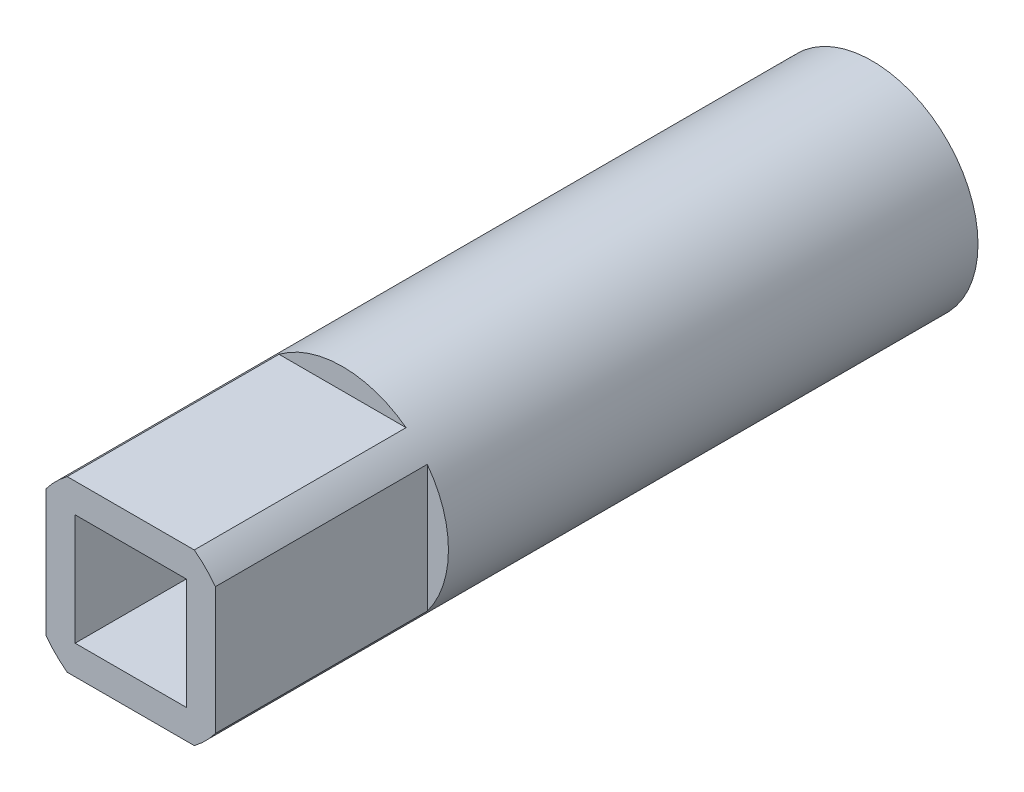
ISO-10303-21;
HEADER;
FILE_DESCRIPTION(('STEP AP214'),'2;1');
FILE_NAME('part.step','',(''),(''),'','','');
FILE_SCHEMA(('AUTOMOTIVE_DESIGN { 1 0 10303 214 1 1 1 1 }'));
ENDSEC;
DATA;
#1=APPLICATION_CONTEXT('core data for automotive mechanical design processes');
#2=APPLICATION_PROTOCOL_DEFINITION('international standard','automotive_design',2000,#1);
#3=PRODUCT_CONTEXT('',#1,'mechanical');
#4=PRODUCT('Part','Part','',(#3));
#5=PRODUCT_RELATED_PRODUCT_CATEGORY('part','',(#4));
#6=PRODUCT_DEFINITION_FORMATION('','',#4);
#7=PRODUCT_DEFINITION_CONTEXT('part definition',#1,'design');
#8=PRODUCT_DEFINITION('design','',#6,#7);
#9=PRODUCT_DEFINITION_SHAPE('','',#8);
#10=(LENGTH_UNIT() NAMED_UNIT(*) SI_UNIT(.MILLI.,.METRE.));
#11=(NAMED_UNIT(*) PLANE_ANGLE_UNIT() SI_UNIT($,.RADIAN.));
#12=(NAMED_UNIT(*) SI_UNIT($,.STERADIAN.) SOLID_ANGLE_UNIT());
#13=UNCERTAINTY_MEASURE_WITH_UNIT(LENGTH_MEASURE(1.E-05),#10,'distance_accuracy_value','');
#14=(GEOMETRIC_REPRESENTATION_CONTEXT(3) GLOBAL_UNCERTAINTY_ASSIGNED_CONTEXT((#13)) GLOBAL_UNIT_ASSIGNED_CONTEXT((#10,
#11,#12)) REPRESENTATION_CONTEXT('',''));
#15=CARTESIAN_POINT('',(0.,0.,0.));
#16=DIRECTION('',(0.,0.,1.));
#17=DIRECTION('',(1.,0.,0.));
#18=AXIS2_PLACEMENT_3D('',#15,#16,#17);
#19=CARTESIAN_POINT('',(0.,0.,25.));
#20=DIRECTION('',(0.,0.,1.));
#21=DIRECTION('',(1.,0.,0.));
#22=AXIS2_PLACEMENT_3D('',#19,#20,#21);
#23=PLANE('',#22);
#24=CARTESIAN_POINT('',(0.,0.,25.));
#25=DIRECTION('',(0.,0.,1.));
#26=DIRECTION('',(1.,0.,0.));
#27=AXIS2_PLACEMENT_3D('',#24,#25,#26);
#28=CIRCLE('',#27,5.);
#29=CARTESIAN_POINT('',(-4.,3.,25.));
#30=VERTEX_POINT('',#29);
#31=CARTESIAN_POINT('',(-4.,-3.,25.));
#32=VERTEX_POINT('',#31);
#33=EDGE_CURVE('E54',#30,#32,#28,.T.);
#34=ORIENTED_EDGE('',*,*,#33,.T.);
#35=DIRECTION('',(0.,1.,0.));
#36=VECTOR('',#35,1.);
#37=CARTESIAN_POINT('',(-4.,0.,25.));
#38=LINE('',#37,#36);
#39=EDGE_CURVE('E236',#32,#30,#38,.T.);
#40=ORIENTED_EDGE('',*,*,#39,.T.);
#41=EDGE_LOOP('',(#34,#40));
#42=FACE_BOUND('',#41,.T.);
#43=ADVANCED_FACE('F44',(#42),#23,.T.);
#44=CARTESIAN_POINT('',(3.,4.,25.));
#45=VERTEX_POINT('',#44);
#46=CARTESIAN_POINT('',(-3.,4.,25.));
#47=VERTEX_POINT('',#46);
#48=EDGE_CURVE('E11',#45,#47,#28,.T.);
#49=ORIENTED_EDGE('',*,*,#48,.T.);
#50=DIRECTION('',(1.,0.,0.));
#51=VECTOR('',#50,1.);
#52=CARTESIAN_POINT('',(0.,4.,25.));
#53=LINE('',#52,#51);
#54=EDGE_CURVE('E232',#47,#45,#53,.T.);
#55=ORIENTED_EDGE('',*,*,#54,.T.);
#56=EDGE_LOOP('',(#49,#55));
#57=FACE_BOUND('',#56,.T.);
#58=ADVANCED_FACE('F341',(#57),#23,.T.);
#59=DIRECTION('',(1.,0.,0.));
#60=VECTOR('',#59,1.);
#61=CARTESIAN_POINT('',(0.,-4.,25.));
#62=LINE('',#61,#60);
#63=CARTESIAN_POINT('',(-3.,-4.,25.));
#64=VERTEX_POINT('',#63);
#65=CARTESIAN_POINT('',(3.,-4.,25.));
#66=VERTEX_POINT('',#65);
#67=EDGE_CURVE('E214',#64,#66,#62,.T.);
#68=ORIENTED_EDGE('',*,*,#67,.F.);
#69=EDGE_CURVE('E317',#64,#66,#28,.T.);
#70=ORIENTED_EDGE('',*,*,#69,.T.);
#71=EDGE_LOOP('',(#68,#70));
#72=FACE_BOUND('',#71,.T.);
#73=ADVANCED_FACE('F337',(#72),#23,.T.);
#74=CARTESIAN_POINT('',(0.,0.,25.));
#75=DIRECTION('',(0.,0.,-1.));
#76=DIRECTION('',(-1.,0.,0.));
#77=AXIS2_PLACEMENT_3D('',#74,#75,#76);
#78=CYLINDRICAL_SURFACE('',#77,5.);
#79=ORIENTED_EDGE('',*,*,#48,.F.);
#80=DIRECTION('',(0.,0.,-1.));
#81=VECTOR('',#80,1.);
#82=CARTESIAN_POINT('',(3.,4.,35.));
#83=LINE('',#82,#81);
#84=CARTESIAN_POINT('',(3.,4.,35.));
#85=VERTEX_POINT('',#84);
#86=EDGE_CURVE('E263',#85,#45,#83,.T.);
#87=ORIENTED_EDGE('',*,*,#86,.F.);
#88=CARTESIAN_POINT('',(0.,0.,35.));
#89=DIRECTION('',(0.,0.,1.));
#90=DIRECTION('',(1.,0.,0.));
#91=AXIS2_PLACEMENT_3D('',#88,#89,#90);
#92=CIRCLE('',#91,5.);
#93=CARTESIAN_POINT('',(4.,3.,35.));
#94=VERTEX_POINT('',#93);
#95=EDGE_CURVE('E220',#94,#85,#92,.T.);
#96=ORIENTED_EDGE('',*,*,#95,.F.);
#97=DIRECTION('',(0.,0.,-1.));
#98=VECTOR('',#97,1.);
#99=CARTESIAN_POINT('',(4.,3.,35.));
#100=LINE('',#99,#98);
#101=CARTESIAN_POINT('',(4.,3.,25.));
#102=VERTEX_POINT('',#101);
#103=EDGE_CURVE('E270',#94,#102,#100,.T.);
#104=ORIENTED_EDGE('',*,*,#103,.T.);
#105=CARTESIAN_POINT('',(4.,-3.,25.));
#106=VERTEX_POINT('',#105);
#107=EDGE_CURVE('E57',#106,#102,#28,.T.);
#108=ORIENTED_EDGE('',*,*,#107,.F.);
#109=DIRECTION('',(0.,0.,-1.));
#110=VECTOR('',#109,1.);
#111=CARTESIAN_POINT('',(4.,-3.,35.));
#112=LINE('',#111,#110);
#113=CARTESIAN_POINT('',(4.,-3.,35.));
#114=VERTEX_POINT('',#113);
#115=EDGE_CURVE('E271',#114,#106,#112,.T.);
#116=ORIENTED_EDGE('',*,*,#115,.F.);
#117=CARTESIAN_POINT('',(3.,-4.,35.));
#118=VERTEX_POINT('',#117);
#119=EDGE_CURVE('E209',#118,#114,#92,.T.);
#120=ORIENTED_EDGE('',*,*,#119,.F.);
#121=DIRECTION('',(0.,0.,-1.));
#122=VECTOR('',#121,1.);
#123=CARTESIAN_POINT('',(3.,-4.,35.));
#124=LINE('',#123,#122);
#125=EDGE_CURVE('E231',#118,#66,#124,.T.);
#126=ORIENTED_EDGE('',*,*,#125,.T.);
#127=ORIENTED_EDGE('',*,*,#69,.F.);
#128=DIRECTION('',(0.,0.,-1.));
#129=VECTOR('',#128,1.);
#130=CARTESIAN_POINT('',(-3.,-4.,35.));
#131=LINE('',#130,#129);
#132=CARTESIAN_POINT('',(-3.,-4.,35.));
#133=VERTEX_POINT('',#132);
#134=EDGE_CURVE('E246',#133,#64,#131,.T.);
#135=ORIENTED_EDGE('',*,*,#134,.F.);
#136=CARTESIAN_POINT('',(-4.,-3.,35.));
#137=VERTEX_POINT('',#136);
#138=EDGE_CURVE('E216',#137,#133,#92,.T.);
#139=ORIENTED_EDGE('',*,*,#138,.F.);
#140=DIRECTION('',(0.,0.,-1.));
#141=VECTOR('',#140,1.);
#142=CARTESIAN_POINT('',(-4.,-3.,35.));
#143=LINE('',#142,#141);
#144=EDGE_CURVE('E253',#137,#32,#143,.T.);
#145=ORIENTED_EDGE('',*,*,#144,.T.);
#146=ORIENTED_EDGE('',*,*,#33,.F.);
#147=DIRECTION('',(0.,0.,-1.));
#148=VECTOR('',#147,1.);
#149=CARTESIAN_POINT('',(-4.,3.,35.));
#150=LINE('',#149,#148);
#151=CARTESIAN_POINT('',(-4.,3.,35.));
#152=VERTEX_POINT('',#151);
#153=EDGE_CURVE('E254',#152,#30,#150,.T.);
#154=ORIENTED_EDGE('',*,*,#153,.F.);
#155=CARTESIAN_POINT('',(-3.,4.,35.));
#156=VERTEX_POINT('',#155);
#157=EDGE_CURVE('E221',#156,#152,#92,.T.);
#158=ORIENTED_EDGE('',*,*,#157,.F.);
#159=DIRECTION('',(0.,0.,-1.));
#160=VECTOR('',#159,1.);
#161=CARTESIAN_POINT('',(-3.,4.,35.));
#162=LINE('',#161,#160);
#163=EDGE_CURVE('E259',#156,#47,#162,.T.);
#164=ORIENTED_EDGE('',*,*,#163,.T.);
#165=EDGE_LOOP('',(#79,#87,#96,#104,#108,#116,#120,#126,#127,#135,#139,#145,#146,#154,#158,#164));
#166=FACE_BOUND('',#165,.T.);
#167=CARTESIAN_POINT('',(0.,0.,0.));
#168=DIRECTION('',(0.,0.,1.));
#169=DIRECTION('',(1.,0.,0.));
#170=AXIS2_PLACEMENT_3D('',#167,#168,#169);
#171=CIRCLE('',#170,5.);
#172=CARTESIAN_POINT('',(5.,0.,0.));
#173=VERTEX_POINT('',#172);
#174=EDGE_CURVE('E47',#173,#173,#171,.T.);
#175=ORIENTED_EDGE('',*,*,#174,.T.);
#176=EDGE_LOOP('',(#175));
#177=FACE_BOUND('',#176,.T.);
#178=ADVANCED_FACE('F50',(#166,#177),#78,.T.);
#179=DIRECTION('',(0.,1.,0.));
#180=VECTOR('',#179,1.);
#181=CARTESIAN_POINT('',(4.,0.,25.));
#182=LINE('',#181,#180);
#183=EDGE_CURVE('E67',#106,#102,#182,.T.);
#184=ORIENTED_EDGE('',*,*,#183,.F.);
#185=ORIENTED_EDGE('',*,*,#107,.T.);
#186=EDGE_LOOP('',(#184,#185));
#187=FACE_BOUND('',#186,.T.);
#188=ADVANCED_FACE('F328',(#187),#23,.T.);
#189=CARTESIAN_POINT('',(0.,0.,0.));
#190=DIRECTION('',(0.,0.,1.));
#191=DIRECTION('',(1.,0.,0.));
#192=AXIS2_PLACEMENT_3D('',#189,#190,#191);
#193=PLANE('',#192);
#194=DIRECTION('',(1.,0.,0.));
#195=VECTOR('',#194,1.);
#196=CARTESIAN_POINT('',(2.11233579733012,1.77246136557382,0.));
#197=LINE('',#196,#195);
#198=CARTESIAN_POINT('',(-2.13030488978917,1.77246136557382,0.));
#199=VERTEX_POINT('',#198);
#200=CARTESIAN_POINT('',(2.11233579733012,1.77246136557382,0.));
#201=VERTEX_POINT('',#200);
#202=EDGE_CURVE('E298',#199,#201,#197,.T.);
#203=ORIENTED_EDGE('',*,*,#202,.F.);
#204=CARTESIAN_POINT('',(-0.00898454622952653,0.0224613655738155,0.));
#205=DIRECTION('',(0.,0.,-1.));
#206=DIRECTION('',(-1.,0.,0.));
#207=AXIS2_PLACEMENT_3D('',#204,#205,#206);
#208=CIRCLE('',#207,2.75);
#209=CARTESIAN_POINT('',(-2.13030488978917,-1.72753863442618,0.));
#210=VERTEX_POINT('',#209);
#211=EDGE_CURVE('E274',#210,#199,#208,.T.);
#212=ORIENTED_EDGE('',*,*,#211,.F.);
#213=DIRECTION('',(-1.,0.,0.));
#214=VECTOR('',#213,1.);
#215=CARTESIAN_POINT('',(2.11233579733012,-1.72753863442618,0.));
#216=LINE('',#215,#214);
#217=CARTESIAN_POINT('',(2.11233579733012,-1.72753863442618,0.));
#218=VERTEX_POINT('',#217);
#219=EDGE_CURVE('E283',#218,#210,#216,.T.);
#220=ORIENTED_EDGE('',*,*,#219,.F.);
#221=CARTESIAN_POINT('',(-0.00898454622952653,0.0224613655738155,0.));
#222=DIRECTION('',(0.,0.,-1.));
#223=DIRECTION('',(-1.,0.,0.));
#224=AXIS2_PLACEMENT_3D('',#221,#222,#223);
#225=CIRCLE('',#224,2.75);
#226=EDGE_CURVE('E299',#201,#218,#225,.T.);
#227=ORIENTED_EDGE('',*,*,#226,.F.);
#228=EDGE_LOOP('',(#203,#212,#220,#227));
#229=FACE_BOUND('',#228,.T.);
#230=ORIENTED_EDGE('',*,*,#174,.F.);
#231=EDGE_LOOP('',(#230));
#232=FACE_BOUND('',#231,.T.);
#233=ADVANCED_FACE('F326',(#229,#232),#193,.F.);
#234=CARTESIAN_POINT('',(-0.00898454622952653,0.0224613655738155,9.3));
#235=DIRECTION('',(0.,0.,-1.));
#236=DIRECTION('',(-1.,0.,0.));
#237=AXIS2_PLACEMENT_3D('',#234,#235,#236);
#238=CYLINDRICAL_SURFACE('',#237,2.75);
#239=ORIENTED_EDGE('',*,*,#211,.T.);
#240=DIRECTION('',(0.,0.,-1.));
#241=VECTOR('',#240,1.);
#242=CARTESIAN_POINT('',(-2.13030488978917,1.77246136557382,9.3));
#243=LINE('',#242,#241);
#244=CARTESIAN_POINT('',(-2.13030488978917,1.77246136557382,9.3));
#245=VERTEX_POINT('',#244);
#246=EDGE_CURVE('E291',#245,#199,#243,.T.);
#247=ORIENTED_EDGE('',*,*,#246,.F.);
#248=CARTESIAN_POINT('',(-0.00898454622952653,0.0224613655738155,9.3));
#249=DIRECTION('',(0.,0.,-1.));
#250=DIRECTION('',(-1.,0.,0.));
#251=AXIS2_PLACEMENT_3D('',#248,#249,#250);
#252=CIRCLE('',#251,2.75);
#253=CARTESIAN_POINT('',(-2.13030488978917,-1.72753863442618,9.3));
#254=VERTEX_POINT('',#253);
#255=EDGE_CURVE('E277',#254,#245,#252,.T.);
#256=ORIENTED_EDGE('',*,*,#255,.F.);
#257=DIRECTION('',(0.,0.,-1.));
#258=VECTOR('',#257,1.);
#259=CARTESIAN_POINT('',(-2.13030488978917,-1.72753863442618,9.3));
#260=LINE('',#259,#258);
#261=EDGE_CURVE('E307',#254,#210,#260,.T.);
#262=ORIENTED_EDGE('',*,*,#261,.T.);
#263=EDGE_LOOP('',(#239,#247,#256,#262));
#264=FACE_BOUND('',#263,.T.);
#265=ADVANCED_FACE('F327',(#264),#238,.F.);
#266=CARTESIAN_POINT('',(2.11233579733012,-1.72753863442618,9.3));
#267=DIRECTION('',(0.,-1.,0.));
#268=DIRECTION('',(1.,0.,0.));
#269=AXIS2_PLACEMENT_3D('',#266,#267,#268);
#270=PLANE('',#269);
#271=ORIENTED_EDGE('',*,*,#219,.T.);
#272=ORIENTED_EDGE('',*,*,#261,.F.);
#273=DIRECTION('',(-1.,0.,0.));
#274=VECTOR('',#273,1.);
#275=CARTESIAN_POINT('',(2.11233579733012,-1.72753863442618,9.3));
#276=LINE('',#275,#274);
#277=CARTESIAN_POINT('',(2.11233579733012,-1.72753863442618,9.3));
#278=VERTEX_POINT('',#277);
#279=EDGE_CURVE('E288',#278,#254,#276,.T.);
#280=ORIENTED_EDGE('',*,*,#279,.F.);
#281=DIRECTION('',(0.,0.,-1.));
#282=VECTOR('',#281,1.);
#283=CARTESIAN_POINT('',(2.11233579733012,-1.72753863442618,9.3));
#284=LINE('',#283,#282);
#285=EDGE_CURVE('E309',#278,#218,#284,.T.);
#286=ORIENTED_EDGE('',*,*,#285,.T.);
#287=EDGE_LOOP('',(#271,#272,#280,#286));
#288=FACE_BOUND('',#287,.T.);
#289=ADVANCED_FACE('F331',(#288),#270,.F.);
#290=CARTESIAN_POINT('',(-0.00898454622952653,0.0224613655738155,9.3));
#291=DIRECTION('',(0.,0.,-1.));
#292=DIRECTION('',(-1.,0.,0.));
#293=AXIS2_PLACEMENT_3D('',#290,#291,#292);
#294=CYLINDRICAL_SURFACE('',#293,2.75);
#295=ORIENTED_EDGE('',*,*,#226,.T.);
#296=ORIENTED_EDGE('',*,*,#285,.F.);
#297=CARTESIAN_POINT('',(-0.00898454622952653,0.0224613655738155,9.3));
#298=DIRECTION('',(0.,0.,-1.));
#299=DIRECTION('',(-1.,0.,0.));
#300=AXIS2_PLACEMENT_3D('',#297,#298,#299);
#301=CIRCLE('',#300,2.75);
#302=CARTESIAN_POINT('',(2.11233579733012,1.77246136557382,9.3));
#303=VERTEX_POINT('',#302);
#304=EDGE_CURVE('E284',#303,#278,#301,.T.);
#305=ORIENTED_EDGE('',*,*,#304,.F.);
#306=DIRECTION('',(0.,0.,-1.));
#307=VECTOR('',#306,1.);
#308=CARTESIAN_POINT('',(2.11233579733012,1.77246136557382,9.3));
#309=LINE('',#308,#307);
#310=EDGE_CURVE('E311',#303,#201,#309,.T.);
#311=ORIENTED_EDGE('',*,*,#310,.T.);
#312=EDGE_LOOP('',(#295,#296,#305,#311));
#313=FACE_BOUND('',#312,.T.);
#314=ADVANCED_FACE('F352',(#313),#294,.F.);
#315=CARTESIAN_POINT('',(2.11233579733012,1.77246136557382,9.3));
#316=DIRECTION('',(0.,1.,0.));
#317=DIRECTION('',(-1.,0.,0.));
#318=AXIS2_PLACEMENT_3D('',#315,#316,#317);
#319=PLANE('',#318);
#320=ORIENTED_EDGE('',*,*,#202,.T.);
#321=ORIENTED_EDGE('',*,*,#310,.F.);
#322=DIRECTION('',(1.,0.,0.));
#323=VECTOR('',#322,1.);
#324=CARTESIAN_POINT('',(2.11233579733012,1.77246136557382,9.3));
#325=LINE('',#324,#323);
#326=EDGE_CURVE('E278',#245,#303,#325,.T.);
#327=ORIENTED_EDGE('',*,*,#326,.F.);
#328=ORIENTED_EDGE('',*,*,#246,.T.);
#329=EDGE_LOOP('',(#320,#321,#327,#328));
#330=FACE_BOUND('',#329,.T.);
#331=ADVANCED_FACE('F348',(#330),#319,.F.);
#332=CARTESIAN_POINT('',(-0.00898454622952653,0.0224613655738155,9.3));
#333=DIRECTION('',(0.,0.,-1.));
#334=DIRECTION('',(-1.,0.,0.));
#335=AXIS2_PLACEMENT_3D('',#332,#333,#334);
#336=PLANE('',#335);
#337=ORIENTED_EDGE('',*,*,#255,.T.);
#338=ORIENTED_EDGE('',*,*,#326,.T.);
#339=ORIENTED_EDGE('',*,*,#304,.T.);
#340=ORIENTED_EDGE('',*,*,#279,.T.);
#341=EDGE_LOOP('',(#337,#338,#339,#340));
#342=FACE_BOUND('',#341,.T.);
#343=ADVANCED_FACE('F351',(#342),#336,.T.);
#344=CARTESIAN_POINT('',(4.,0.,35.));
#345=DIRECTION('',(-1.,0.,0.));
#346=DIRECTION('',(0.,0.,1.));
#347=AXIS2_PLACEMENT_3D('',#344,#345,#346);
#348=PLANE('',#347);
#349=ORIENTED_EDGE('',*,*,#183,.T.);
#350=ORIENTED_EDGE('',*,*,#103,.F.);
#351=DIRECTION('',(0.,1.,0.));
#352=VECTOR('',#351,1.);
#353=CARTESIAN_POINT('',(4.,0.,35.));
#354=LINE('',#353,#352);
#355=EDGE_CURVE('E212',#114,#94,#354,.T.);
#356=ORIENTED_EDGE('',*,*,#355,.F.);
#357=ORIENTED_EDGE('',*,*,#115,.T.);
#358=EDGE_LOOP('',(#349,#350,#356,#357));
#359=FACE_BOUND('',#358,.T.);
#360=ADVANCED_FACE('F361',(#359),#348,.F.);
#361=CARTESIAN_POINT('',(0.,4.,35.));
#362=DIRECTION('',(0.,1.,0.));
#363=DIRECTION('',(0.,0.,1.));
#364=AXIS2_PLACEMENT_3D('',#361,#362,#363);
#365=PLANE('',#364);
#366=ORIENTED_EDGE('',*,*,#54,.F.);
#367=ORIENTED_EDGE('',*,*,#163,.F.);
#368=DIRECTION('',(1.,0.,0.));
#369=VECTOR('',#368,1.);
#370=CARTESIAN_POINT('',(0.,4.,35.));
#371=LINE('',#370,#369);
#372=EDGE_CURVE('E219',#156,#85,#371,.T.);
#373=ORIENTED_EDGE('',*,*,#372,.T.);
#374=ORIENTED_EDGE('',*,*,#86,.T.);
#375=EDGE_LOOP('',(#366,#367,#373,#374));
#376=FACE_BOUND('',#375,.T.);
#377=ADVANCED_FACE('F370',(#376),#365,.T.);
#378=CARTESIAN_POINT('',(-4.,0.,35.));
#379=DIRECTION('',(-1.,0.,0.));
#380=DIRECTION('',(0.,0.,1.));
#381=AXIS2_PLACEMENT_3D('',#378,#379,#380);
#382=PLANE('',#381);
#383=ORIENTED_EDGE('',*,*,#39,.F.);
#384=ORIENTED_EDGE('',*,*,#144,.F.);
#385=DIRECTION('',(0.,1.,0.));
#386=VECTOR('',#385,1.);
#387=CARTESIAN_POINT('',(-4.,0.,35.));
#388=LINE('',#387,#386);
#389=EDGE_CURVE('E223',#137,#152,#388,.T.);
#390=ORIENTED_EDGE('',*,*,#389,.T.);
#391=ORIENTED_EDGE('',*,*,#153,.T.);
#392=EDGE_LOOP('',(#383,#384,#390,#391));
#393=FACE_BOUND('',#392,.T.);
#394=ADVANCED_FACE('F371',(#393),#382,.T.);
#395=CARTESIAN_POINT('',(0.,-4.,35.));
#396=DIRECTION('',(0.,1.,0.));
#397=DIRECTION('',(0.,0.,1.));
#398=AXIS2_PLACEMENT_3D('',#395,#396,#397);
#399=PLANE('',#398);
#400=ORIENTED_EDGE('',*,*,#67,.T.);
#401=ORIENTED_EDGE('',*,*,#125,.F.);
#402=DIRECTION('',(1.,0.,0.));
#403=VECTOR('',#402,1.);
#404=CARTESIAN_POINT('',(0.,-4.,35.));
#405=LINE('',#404,#403);
#406=EDGE_CURVE('E227',#133,#118,#405,.T.);
#407=ORIENTED_EDGE('',*,*,#406,.F.);
#408=ORIENTED_EDGE('',*,*,#134,.T.);
#409=EDGE_LOOP('',(#400,#401,#407,#408));
#410=FACE_BOUND('',#409,.T.);
#411=ADVANCED_FACE('F374',(#410),#399,.F.);
#412=CARTESIAN_POINT('',(0.,0.,35.));
#413=DIRECTION('',(0.,0.,1.));
#414=DIRECTION('',(1.,0.,0.));
#415=AXIS2_PLACEMENT_3D('',#412,#413,#414);
#416=PLANE('',#415);
#417=DIRECTION('',(0.,1.,0.));
#418=VECTOR('',#417,1.);
#419=CARTESIAN_POINT('',(2.625,-2.625,35.));
#420=LINE('',#419,#418);
#421=CARTESIAN_POINT('',(2.625,-2.625,35.));
#422=VERTEX_POINT('',#421);
#423=CARTESIAN_POINT('',(2.625,2.625,35.));
#424=VERTEX_POINT('',#423);
#425=EDGE_CURVE('E61',#422,#424,#420,.T.);
#426=ORIENTED_EDGE('',*,*,#425,.F.);
#427=DIRECTION('',(1.,0.,0.));
#428=VECTOR('',#427,1.);
#429=CARTESIAN_POINT('',(-2.625,-2.625,35.));
#430=LINE('',#429,#428);
#431=CARTESIAN_POINT('',(-2.625,-2.625,35.));
#432=VERTEX_POINT('',#431);
#433=EDGE_CURVE('E181',#432,#422,#430,.T.);
#434=ORIENTED_EDGE('',*,*,#433,.F.);
#435=DIRECTION('',(0.,-1.,0.));
#436=VECTOR('',#435,1.);
#437=CARTESIAN_POINT('',(-2.625,-2.625,35.));
#438=LINE('',#437,#436);
#439=CARTESIAN_POINT('',(-2.625,2.625,35.));
#440=VERTEX_POINT('',#439);
#441=EDGE_CURVE('E190',#440,#432,#438,.T.);
#442=ORIENTED_EDGE('',*,*,#441,.F.);
#443=DIRECTION('',(-1.,0.,0.));
#444=VECTOR('',#443,1.);
#445=CARTESIAN_POINT('',(-2.625,2.625,35.));
#446=LINE('',#445,#444);
#447=EDGE_CURVE('E198',#424,#440,#446,.T.);
#448=ORIENTED_EDGE('',*,*,#447,.F.);
#449=EDGE_LOOP('',(#426,#434,#442,#448));
#450=FACE_BOUND('',#449,.T.);
#451=ORIENTED_EDGE('',*,*,#119,.T.);
#452=ORIENTED_EDGE('',*,*,#355,.T.);
#453=ORIENTED_EDGE('',*,*,#95,.T.);
#454=ORIENTED_EDGE('',*,*,#372,.F.);
#455=ORIENTED_EDGE('',*,*,#157,.T.);
#456=ORIENTED_EDGE('',*,*,#389,.F.);
#457=ORIENTED_EDGE('',*,*,#138,.T.);
#458=ORIENTED_EDGE('',*,*,#406,.T.);
#459=EDGE_LOOP('',(#451,#452,#453,#454,#455,#456,#457,#458));
#460=FACE_BOUND('',#459,.T.);
#461=ADVANCED_FACE('F377',(#450,#460),#416,.T.);
#462=CARTESIAN_POINT('',(2.625,-2.625,25.));
#463=DIRECTION('',(1.,0.,0.));
#464=DIRECTION('',(0.,0.,-1.));
#465=AXIS2_PLACEMENT_3D('',#462,#463,#464);
#466=PLANE('',#465);
#467=ORIENTED_EDGE('',*,*,#425,.T.);
#468=DIRECTION('',(0.,0.,1.));
#469=VECTOR('',#468,1.);
#470=CARTESIAN_POINT('',(2.625,2.625,25.));
#471=LINE('',#470,#469);
#472=CARTESIAN_POINT('',(2.625,2.625,25.));
#473=VERTEX_POINT('',#472);
#474=EDGE_CURVE('E158',#473,#424,#471,.T.);
#475=ORIENTED_EDGE('',*,*,#474,.F.);
#476=DIRECTION('',(0.,1.,0.));
#477=VECTOR('',#476,1.);
#478=CARTESIAN_POINT('',(2.625,-2.625,25.));
#479=LINE('',#478,#477);
#480=CARTESIAN_POINT('',(2.625,-2.625,25.));
#481=VERTEX_POINT('',#480);
#482=EDGE_CURVE('E165',#481,#473,#479,.T.);
#483=ORIENTED_EDGE('',*,*,#482,.F.);
#484=DIRECTION('',(0.,0.,1.));
#485=VECTOR('',#484,1.);
#486=CARTESIAN_POINT('',(2.625,-2.625,25.));
#487=LINE('',#486,#485);
#488=EDGE_CURVE('E205',#481,#422,#487,.T.);
#489=ORIENTED_EDGE('',*,*,#488,.T.);
#490=EDGE_LOOP('',(#467,#475,#483,#489));
#491=FACE_BOUND('',#490,.T.);
#492=ADVANCED_FACE('F159',(#491),#466,.F.);
#493=CARTESIAN_POINT('',(-2.625,-2.625,25.));
#494=DIRECTION('',(0.,-1.,0.));
#495=DIRECTION('',(0.,0.,-1.));
#496=AXIS2_PLACEMENT_3D('',#493,#494,#495);
#497=PLANE('',#496);
#498=ORIENTED_EDGE('',*,*,#433,.T.);
#499=ORIENTED_EDGE('',*,*,#488,.F.);
#500=DIRECTION('',(1.,0.,0.));
#501=VECTOR('',#500,1.);
#502=CARTESIAN_POINT('',(-2.625,-2.625,25.));
#503=LINE('',#502,#501);
#504=CARTESIAN_POINT('',(-2.625,-2.625,25.));
#505=VERTEX_POINT('',#504);
#506=EDGE_CURVE('E166',#505,#481,#503,.T.);
#507=ORIENTED_EDGE('',*,*,#506,.F.);
#508=DIRECTION('',(0.,0.,1.));
#509=VECTOR('',#508,1.);
#510=CARTESIAN_POINT('',(-2.625,-2.625,25.));
#511=LINE('',#510,#509);
#512=EDGE_CURVE('E202',#505,#432,#511,.T.);
#513=ORIENTED_EDGE('',*,*,#512,.T.);
#514=EDGE_LOOP('',(#498,#499,#507,#513));
#515=FACE_BOUND('',#514,.T.);
#516=ADVANCED_FACE('F387',(#515),#497,.F.);
#517=CARTESIAN_POINT('',(-2.625,-2.625,25.));
#518=DIRECTION('',(-1.,0.,0.));
#519=DIRECTION('',(0.,0.,1.));
#520=AXIS2_PLACEMENT_3D('',#517,#518,#519);
#521=PLANE('',#520);
#522=ORIENTED_EDGE('',*,*,#441,.T.);
#523=ORIENTED_EDGE('',*,*,#512,.F.);
#524=DIRECTION('',(0.,-1.,0.));
#525=VECTOR('',#524,1.);
#526=CARTESIAN_POINT('',(-2.625,-2.625,25.));
#527=LINE('',#526,#525);
#528=CARTESIAN_POINT('',(-2.625,2.625,25.));
#529=VERTEX_POINT('',#528);
#530=EDGE_CURVE('E180',#529,#505,#527,.T.);
#531=ORIENTED_EDGE('',*,*,#530,.F.);
#532=DIRECTION('',(0.,0.,1.));
#533=VECTOR('',#532,1.);
#534=CARTESIAN_POINT('',(-2.625,2.625,25.));
#535=LINE('',#534,#533);
#536=EDGE_CURVE('E169',#529,#440,#535,.T.);
#537=ORIENTED_EDGE('',*,*,#536,.T.);
#538=EDGE_LOOP('',(#522,#523,#531,#537));
#539=FACE_BOUND('',#538,.T.);
#540=ADVANCED_FACE('F386',(#539),#521,.F.);
#541=CARTESIAN_POINT('',(-2.625,2.625,25.));
#542=DIRECTION('',(0.,1.,0.));
#543=DIRECTION('',(0.,0.,1.));
#544=AXIS2_PLACEMENT_3D('',#541,#542,#543);
#545=PLANE('',#544);
#546=ORIENTED_EDGE('',*,*,#447,.T.);
#547=ORIENTED_EDGE('',*,*,#536,.F.);
#548=DIRECTION('',(-1.,0.,0.));
#549=VECTOR('',#548,1.);
#550=CARTESIAN_POINT('',(-2.625,2.625,25.));
#551=LINE('',#550,#549);
#552=EDGE_CURVE('E175',#473,#529,#551,.T.);
#553=ORIENTED_EDGE('',*,*,#552,.F.);
#554=ORIENTED_EDGE('',*,*,#474,.T.);
#555=EDGE_LOOP('',(#546,#547,#553,#554));
#556=FACE_BOUND('',#555,.T.);
#557=ADVANCED_FACE('F171',(#556),#545,.F.);
#558=CARTESIAN_POINT('',(0.,0.,25.));
#559=DIRECTION('',(0.,0.,-1.));
#560=DIRECTION('',(-1.,0.,0.));
#561=AXIS2_PLACEMENT_3D('',#558,#559,#560);
#562=PLANE('',#561);
#563=ORIENTED_EDGE('',*,*,#482,.T.);
#564=ORIENTED_EDGE('',*,*,#552,.T.);
#565=ORIENTED_EDGE('',*,*,#530,.T.);
#566=ORIENTED_EDGE('',*,*,#506,.T.);
#567=EDGE_LOOP('',(#563,#564,#565,#566));
#568=FACE_BOUND('',#567,.T.);
#569=ADVANCED_FACE('F177',(#568),#562,.F.);
#570=CLOSED_SHELL('',(#43,#58,#73,#178,#188,#233,#265,#289,#314,#331,#343,#360,#377,#394,#411,
#461,#492,#516,#540,#557,#569));
#571=MANIFOLD_SOLID_BREP('B2',#570);
#572=ADVANCED_BREP_SHAPE_REPRESENTATION('',(#18,#571),#14);
#573=SHAPE_DEFINITION_REPRESENTATION(#9,#572);
ENDSEC;
END-ISO-10303-21;
